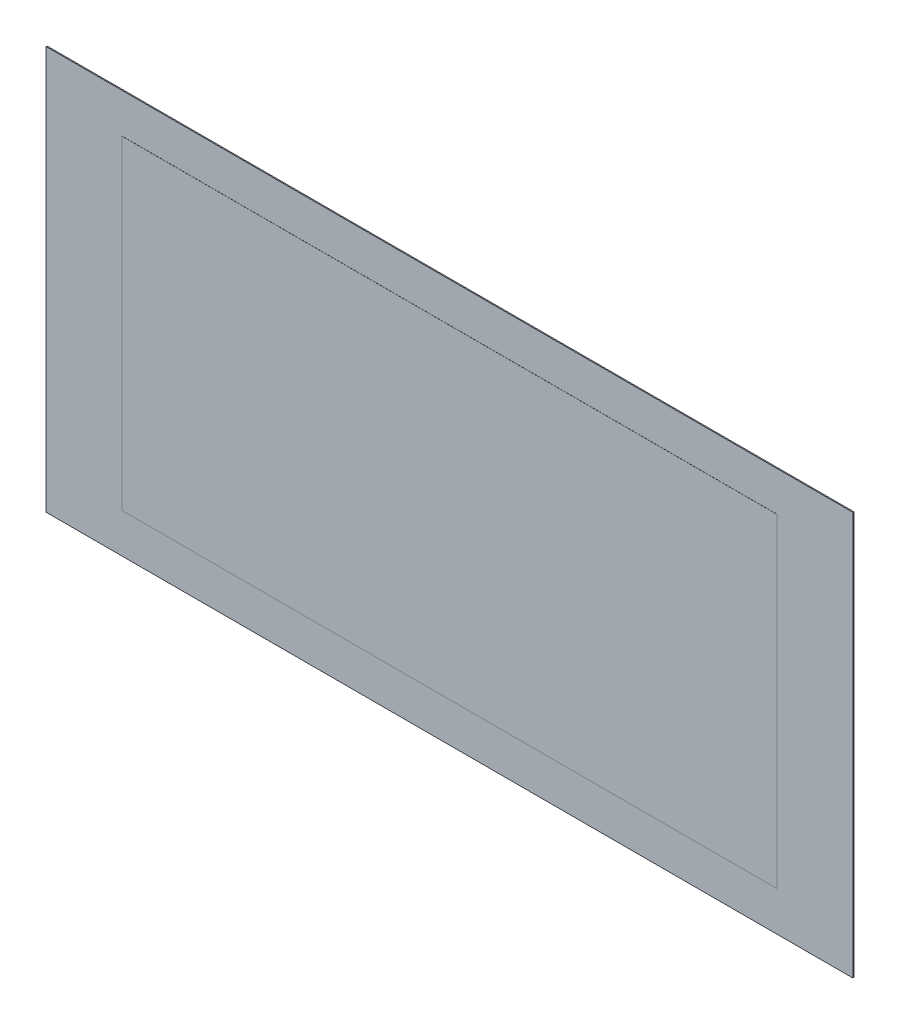
ISO-10303-21;
HEADER;
FILE_DESCRIPTION(('STEP AP214'),'2;1');
FILE_NAME('part.step','',(''),(''),'','','');
FILE_SCHEMA(('AUTOMOTIVE_DESIGN { 1 0 10303 214 1 1 1 1 }'));
ENDSEC;
DATA;
#1=APPLICATION_CONTEXT('core data for automotive mechanical design processes');
#2=APPLICATION_PROTOCOL_DEFINITION('international standard','automotive_design',2000,#1);
#3=PRODUCT_CONTEXT('',#1,'mechanical');
#4=PRODUCT('Part','Part','',(#3));
#5=PRODUCT_RELATED_PRODUCT_CATEGORY('part','',(#4));
#6=PRODUCT_DEFINITION_FORMATION('','',#4);
#7=PRODUCT_DEFINITION_CONTEXT('part definition',#1,'design');
#8=PRODUCT_DEFINITION('design','',#6,#7);
#9=PRODUCT_DEFINITION_SHAPE('','',#8);
#10=(LENGTH_UNIT() NAMED_UNIT(*) SI_UNIT(.MILLI.,.METRE.));
#11=(NAMED_UNIT(*) PLANE_ANGLE_UNIT() SI_UNIT($,.RADIAN.));
#12=(NAMED_UNIT(*) SI_UNIT($,.STERADIAN.) SOLID_ANGLE_UNIT());
#13=UNCERTAINTY_MEASURE_WITH_UNIT(LENGTH_MEASURE(1.E-05),#10,'distance_accuracy_value','');
#14=(GEOMETRIC_REPRESENTATION_CONTEXT(3) GLOBAL_UNCERTAINTY_ASSIGNED_CONTEXT((#13)) GLOBAL_UNIT_ASSIGNED_CONTEXT((#10,
#11,#12)) REPRESENTATION_CONTEXT('',''));
#15=CARTESIAN_POINT('',(0.,0.,0.));
#16=DIRECTION('',(0.,0.,1.));
#17=DIRECTION('',(1.,0.,0.));
#18=AXIS2_PLACEMENT_3D('',#15,#16,#17);
#19=CARTESIAN_POINT('',(1911.604,9162.669,0.));
#20=DIRECTION('',(-1.,0.,0.));
#21=DIRECTION('',(0.,0.,1.));
#22=AXIS2_PLACEMENT_3D('',#19,#20,#21);
#23=PLANE('',#22);
#24=DIRECTION('',(0.,1.,0.));
#25=VECTOR('',#24,1.);
#26=CARTESIAN_POINT('',(1911.604,997.331,0.));
#27=LINE('',#26,#25);
#28=CARTESIAN_POINT('',(1911.604,997.331,0.));
#29=VERTEX_POINT('',#28);
#30=CARTESIAN_POINT('',(1911.604,9162.669,0.));
#31=VERTEX_POINT('',#30);
#32=EDGE_CURVE('E34',#29,#31,#27,.T.);
#33=ORIENTED_EDGE('',*,*,#32,.F.);
#34=DIRECTION('',(0.,0.,1.));
#35=VECTOR('',#34,1.);
#36=CARTESIAN_POINT('',(1911.604,997.331,0.));
#37=LINE('',#36,#35);
#38=CARTESIAN_POINT('',(1911.604,997.331,2.54));
#39=VERTEX_POINT('',#38);
#40=EDGE_CURVE('E10',#29,#39,#37,.T.);
#41=ORIENTED_EDGE('',*,*,#40,.T.);
#42=DIRECTION('',(0.,-1.,0.));
#43=VECTOR('',#42,1.);
#44=CARTESIAN_POINT('',(1911.604,9162.669,2.54));
#45=LINE('',#44,#43);
#46=CARTESIAN_POINT('',(1911.604,9162.669,2.54));
#47=VERTEX_POINT('',#46);
#48=EDGE_CURVE('E112',#47,#39,#45,.T.);
#49=ORIENTED_EDGE('',*,*,#48,.F.);
#50=DIRECTION('',(0.,0.,1.));
#51=VECTOR('',#50,1.);
#52=CARTESIAN_POINT('',(1911.604,9162.669,0.));
#53=LINE('',#52,#51);
#54=EDGE_CURVE('E26',#31,#47,#53,.T.);
#55=ORIENTED_EDGE('',*,*,#54,.F.);
#56=EDGE_LOOP('',(#33,#41,#49,#55));
#57=FACE_BOUND('',#56,.T.);
#58=ADVANCED_FACE('F16',(#57),#23,.T.);
#59=CARTESIAN_POINT('',(18408.396,9162.669,0.));
#60=DIRECTION('',(0.,1.,0.));
#61=DIRECTION('',(0.,0.,1.));
#62=AXIS2_PLACEMENT_3D('',#59,#60,#61);
#63=PLANE('',#62);
#64=DIRECTION('',(1.,0.,0.));
#65=VECTOR('',#64,1.);
#66=CARTESIAN_POINT('',(1911.604,9162.669,0.));
#67=LINE('',#66,#65);
#68=CARTESIAN_POINT('',(18408.396,9162.669,0.));
#69=VERTEX_POINT('',#68);
#70=EDGE_CURVE('E177',#31,#69,#67,.T.);
#71=ORIENTED_EDGE('',*,*,#70,.F.);
#72=ORIENTED_EDGE('',*,*,#54,.T.);
#73=DIRECTION('',(-1.,0.,0.));
#74=VECTOR('',#73,1.);
#75=CARTESIAN_POINT('',(18408.396,9162.669,2.54));
#76=LINE('',#75,#74);
#77=CARTESIAN_POINT('',(18408.396,9162.669,2.54));
#78=VERTEX_POINT('',#77);
#79=EDGE_CURVE('E115',#78,#47,#76,.T.);
#80=ORIENTED_EDGE('',*,*,#79,.F.);
#81=DIRECTION('',(0.,0.,1.));
#82=VECTOR('',#81,1.);
#83=CARTESIAN_POINT('',(18408.396,9162.669,0.));
#84=LINE('',#83,#82);
#85=EDGE_CURVE('E168',#69,#78,#84,.T.);
#86=ORIENTED_EDGE('',*,*,#85,.F.);
#87=EDGE_LOOP('',(#71,#72,#80,#86));
#88=FACE_BOUND('',#87,.T.);
#89=ADVANCED_FACE('F140',(#88),#63,.T.);
#90=CARTESIAN_POINT('',(18408.396,997.330999999997,0.));
#91=DIRECTION('',(1.,0.,0.));
#92=DIRECTION('',(0.,0.,-1.));
#93=AXIS2_PLACEMENT_3D('',#90,#91,#92);
#94=PLANE('',#93);
#95=DIRECTION('',(0.,-1.,0.));
#96=VECTOR('',#95,1.);
#97=CARTESIAN_POINT('',(18408.396,9162.669,0.));
#98=LINE('',#97,#96);
#99=CARTESIAN_POINT('',(18408.396,997.330999999997,0.));
#100=VERTEX_POINT('',#99);
#101=EDGE_CURVE('E174',#69,#100,#98,.T.);
#102=ORIENTED_EDGE('',*,*,#101,.F.);
#103=ORIENTED_EDGE('',*,*,#85,.T.);
#104=DIRECTION('',(0.,1.,0.));
#105=VECTOR('',#104,1.);
#106=CARTESIAN_POINT('',(18408.396,997.330999999997,2.54));
#107=LINE('',#106,#105);
#108=CARTESIAN_POINT('',(18408.396,997.330999999997,2.54));
#109=VERTEX_POINT('',#108);
#110=EDGE_CURVE('E165',#109,#78,#107,.T.);
#111=ORIENTED_EDGE('',*,*,#110,.F.);
#112=DIRECTION('',(0.,0.,1.));
#113=VECTOR('',#112,1.);
#114=CARTESIAN_POINT('',(18408.396,997.330999999997,0.));
#115=LINE('',#114,#113);
#116=EDGE_CURVE('E167',#100,#109,#115,.T.);
#117=ORIENTED_EDGE('',*,*,#116,.F.);
#118=EDGE_LOOP('',(#102,#103,#111,#117));
#119=FACE_BOUND('',#118,.T.);
#120=ADVANCED_FACE('F145',(#119),#94,.T.);
#121=CARTESIAN_POINT('',(1911.604,997.331,0.));
#122=DIRECTION('',(0.,-1.,0.));
#123=DIRECTION('',(0.,0.,-1.));
#124=AXIS2_PLACEMENT_3D('',#121,#122,#123);
#125=PLANE('',#124);
#126=DIRECTION('',(-1.,0.,0.));
#127=VECTOR('',#126,1.);
#128=CARTESIAN_POINT('',(18408.396,997.330999999997,0.));
#129=LINE('',#128,#127);
#130=EDGE_CURVE('E172',#100,#29,#129,.T.);
#131=ORIENTED_EDGE('',*,*,#130,.F.);
#132=ORIENTED_EDGE('',*,*,#116,.T.);
#133=DIRECTION('',(1.,0.,0.));
#134=VECTOR('',#133,1.);
#135=CARTESIAN_POINT('',(1911.604,997.331,2.54));
#136=LINE('',#135,#134);
#137=EDGE_CURVE('E163',#39,#109,#136,.T.);
#138=ORIENTED_EDGE('',*,*,#137,.F.);
#139=ORIENTED_EDGE('',*,*,#40,.F.);
#140=EDGE_LOOP('',(#131,#132,#138,#139));
#141=FACE_BOUND('',#140,.T.);
#142=ADVANCED_FACE('F151',(#141),#125,.T.);
#143=CARTESIAN_POINT('',(10160.,5080.,2.54));
#144=DIRECTION('',(0.,0.,1.));
#145=DIRECTION('',(1.,0.,0.));
#146=AXIS2_PLACEMENT_3D('',#143,#144,#145);
#147=PLANE('',#146);
#148=ORIENTED_EDGE('',*,*,#137,.T.);
#149=ORIENTED_EDGE('',*,*,#110,.T.);
#150=ORIENTED_EDGE('',*,*,#79,.T.);
#151=ORIENTED_EDGE('',*,*,#48,.T.);
#152=EDGE_LOOP('',(#148,#149,#150,#151));
#153=FACE_BOUND('',#152,.T.);
#154=ADVANCED_FACE('F137',(#153),#147,.T.);
#155=CARTESIAN_POINT('',(20320.,10160.,0.));
#156=DIRECTION('',(1.,0.,0.));
#157=DIRECTION('',(0.,0.,-1.));
#158=AXIS2_PLACEMENT_3D('',#155,#156,#157);
#159=PLANE('',#158);
#160=DIRECTION('',(0.,1.,0.));
#161=VECTOR('',#160,1.);
#162=CARTESIAN_POINT('',(20320.,0.,0.));
#163=LINE('',#162,#161);
#164=CARTESIAN_POINT('',(20320.,0.,0.));
#165=VERTEX_POINT('',#164);
#166=CARTESIAN_POINT('',(20320.,10160.,0.));
#167=VERTEX_POINT('',#166);
#168=EDGE_CURVE('E111',#165,#167,#163,.T.);
#169=ORIENTED_EDGE('',*,*,#168,.F.);
#170=DIRECTION('',(0.,0.,-1.));
#171=VECTOR('',#170,1.);
#172=CARTESIAN_POINT('',(20320.,0.,0.));
#173=LINE('',#172,#171);
#174=CARTESIAN_POINT('',(20320.,0.,-25.4));
#175=VERTEX_POINT('',#174);
#176=EDGE_CURVE('E109',#165,#175,#173,.T.);
#177=ORIENTED_EDGE('',*,*,#176,.T.);
#178=DIRECTION('',(0.,-1.,0.));
#179=VECTOR('',#178,1.);
#180=CARTESIAN_POINT('',(20320.,10160.,-25.4));
#181=LINE('',#180,#179);
#182=CARTESIAN_POINT('',(20320.,10160.,-25.4));
#183=VERTEX_POINT('',#182);
#184=EDGE_CURVE('E103',#183,#175,#181,.T.);
#185=ORIENTED_EDGE('',*,*,#184,.F.);
#186=DIRECTION('',(0.,0.,-1.));
#187=VECTOR('',#186,1.);
#188=CARTESIAN_POINT('',(20320.,10160.,0.));
#189=LINE('',#188,#187);
#190=EDGE_CURVE('E113',#167,#183,#189,.T.);
#191=ORIENTED_EDGE('',*,*,#190,.F.);
#192=EDGE_LOOP('',(#169,#177,#185,#191));
#193=FACE_BOUND('',#192,.T.);
#194=ADVANCED_FACE('F110',(#193),#159,.T.);
#195=CARTESIAN_POINT('',(0.,10160.,0.));
#196=DIRECTION('',(0.,1.,0.));
#197=DIRECTION('',(0.,0.,1.));
#198=AXIS2_PLACEMENT_3D('',#195,#196,#197);
#199=PLANE('',#198);
#200=DIRECTION('',(-1.,0.,0.));
#201=VECTOR('',#200,1.);
#202=CARTESIAN_POINT('',(20320.,10160.,0.));
#203=LINE('',#202,#201);
#204=CARTESIAN_POINT('',(0.,10160.,0.));
#205=VERTEX_POINT('',#204);
#206=EDGE_CURVE('E121',#167,#205,#203,.T.);
#207=ORIENTED_EDGE('',*,*,#206,.F.);
#208=ORIENTED_EDGE('',*,*,#190,.T.);
#209=DIRECTION('',(1.,0.,0.));
#210=VECTOR('',#209,1.);
#211=CARTESIAN_POINT('',(0.,10160.,-25.4));
#212=LINE('',#211,#210);
#213=CARTESIAN_POINT('',(0.,10160.,-25.4));
#214=VERTEX_POINT('',#213);
#215=EDGE_CURVE('E94',#214,#183,#212,.T.);
#216=ORIENTED_EDGE('',*,*,#215,.F.);
#217=DIRECTION('',(0.,0.,-1.));
#218=VECTOR('',#217,1.);
#219=CARTESIAN_POINT('',(0.,10160.,0.));
#220=LINE('',#219,#218);
#221=EDGE_CURVE('E90',#205,#214,#220,.T.);
#222=ORIENTED_EDGE('',*,*,#221,.F.);
#223=EDGE_LOOP('',(#207,#208,#216,#222));
#224=FACE_BOUND('',#223,.T.);
#225=ADVANCED_FACE('F128',(#224),#199,.T.);
#226=CARTESIAN_POINT('',(0.,0.,0.));
#227=DIRECTION('',(-1.,0.,0.));
#228=DIRECTION('',(0.,0.,1.));
#229=AXIS2_PLACEMENT_3D('',#226,#227,#228);
#230=PLANE('',#229);
#231=DIRECTION('',(0.,-1.,0.));
#232=VECTOR('',#231,1.);
#233=CARTESIAN_POINT('',(0.,10160.,0.));
#234=LINE('',#233,#232);
#235=CARTESIAN_POINT('',(0.,0.,0.));
#236=VERTEX_POINT('',#235);
#237=EDGE_CURVE('E78',#205,#236,#234,.T.);
#238=ORIENTED_EDGE('',*,*,#237,.F.);
#239=ORIENTED_EDGE('',*,*,#221,.T.);
#240=DIRECTION('',(0.,1.,0.));
#241=VECTOR('',#240,1.);
#242=CARTESIAN_POINT('',(0.,0.,-25.4));
#243=LINE('',#242,#241);
#244=CARTESIAN_POINT('',(0.,0.,-25.4));
#245=VERTEX_POINT('',#244);
#246=EDGE_CURVE('E84',#245,#214,#243,.T.);
#247=ORIENTED_EDGE('',*,*,#246,.F.);
#248=DIRECTION('',(0.,0.,-1.));
#249=VECTOR('',#248,1.);
#250=CARTESIAN_POINT('',(0.,0.,0.));
#251=LINE('',#250,#249);
#252=EDGE_CURVE('E87',#236,#245,#251,.T.);
#253=ORIENTED_EDGE('',*,*,#252,.F.);
#254=EDGE_LOOP('',(#238,#239,#247,#253));
#255=FACE_BOUND('',#254,.T.);
#256=ADVANCED_FACE('F86',(#255),#230,.T.);
#257=CARTESIAN_POINT('',(20320.,0.,0.));
#258=DIRECTION('',(0.,-1.,0.));
#259=DIRECTION('',(0.,0.,-1.));
#260=AXIS2_PLACEMENT_3D('',#257,#258,#259);
#261=PLANE('',#260);
#262=DIRECTION('',(1.,0.,0.));
#263=VECTOR('',#262,1.);
#264=CARTESIAN_POINT('',(0.,0.,0.));
#265=LINE('',#264,#263);
#266=EDGE_CURVE('E100',#236,#165,#265,.T.);
#267=ORIENTED_EDGE('',*,*,#266,.F.);
#268=ORIENTED_EDGE('',*,*,#252,.T.);
#269=DIRECTION('',(-1.,0.,0.));
#270=VECTOR('',#269,1.);
#271=CARTESIAN_POINT('',(20320.,0.,-25.4));
#272=LINE('',#271,#270);
#273=EDGE_CURVE('E20',#175,#245,#272,.T.);
#274=ORIENTED_EDGE('',*,*,#273,.F.);
#275=ORIENTED_EDGE('',*,*,#176,.F.);
#276=EDGE_LOOP('',(#267,#268,#274,#275));
#277=FACE_BOUND('',#276,.T.);
#278=ADVANCED_FACE('F98',(#277),#261,.T.);
#279=CARTESIAN_POINT('',(10160.,5080.,-25.4));
#280=DIRECTION('',(0.,0.,1.));
#281=DIRECTION('',(1.,0.,0.));
#282=AXIS2_PLACEMENT_3D('',#279,#280,#281);
#283=PLANE('',#282);
#284=ORIENTED_EDGE('',*,*,#273,.T.);
#285=ORIENTED_EDGE('',*,*,#246,.T.);
#286=ORIENTED_EDGE('',*,*,#215,.T.);
#287=ORIENTED_EDGE('',*,*,#184,.T.);
#288=EDGE_LOOP('',(#284,#285,#286,#287));
#289=FACE_BOUND('',#288,.T.);
#290=ADVANCED_FACE('F102',(#289),#283,.F.);
#291=CARTESIAN_POINT('',(10160.,5080.,0.));
#292=DIRECTION('',(0.,0.,1.));
#293=DIRECTION('',(1.,0.,0.));
#294=AXIS2_PLACEMENT_3D('',#291,#292,#293);
#295=PLANE('',#294);
#296=ORIENTED_EDGE('',*,*,#266,.T.);
#297=ORIENTED_EDGE('',*,*,#168,.T.);
#298=ORIENTED_EDGE('',*,*,#206,.T.);
#299=ORIENTED_EDGE('',*,*,#237,.T.);
#300=EDGE_LOOP('',(#296,#297,#298,#299));
#301=FACE_BOUND('',#300,.T.);
#302=ORIENTED_EDGE('',*,*,#32,.T.);
#303=ORIENTED_EDGE('',*,*,#70,.T.);
#304=ORIENTED_EDGE('',*,*,#101,.T.);
#305=ORIENTED_EDGE('',*,*,#130,.T.);
#306=EDGE_LOOP('',(#302,#303,#304,#305));
#307=FACE_BOUND('',#306,.T.);
#308=ADVANCED_FACE('F18',(#301,#307),#295,.T.);
#309=CLOSED_SHELL('',(#58,#89,#120,#142,#154,#194,#225,#256,#278,#290,#308));
#310=MANIFOLD_SOLID_BREP('B1',#309);
#311=ADVANCED_BREP_SHAPE_REPRESENTATION('',(#18,#310),#14);
#312=SHAPE_DEFINITION_REPRESENTATION(#9,#311);
ENDSEC;
END-ISO-10303-21;
